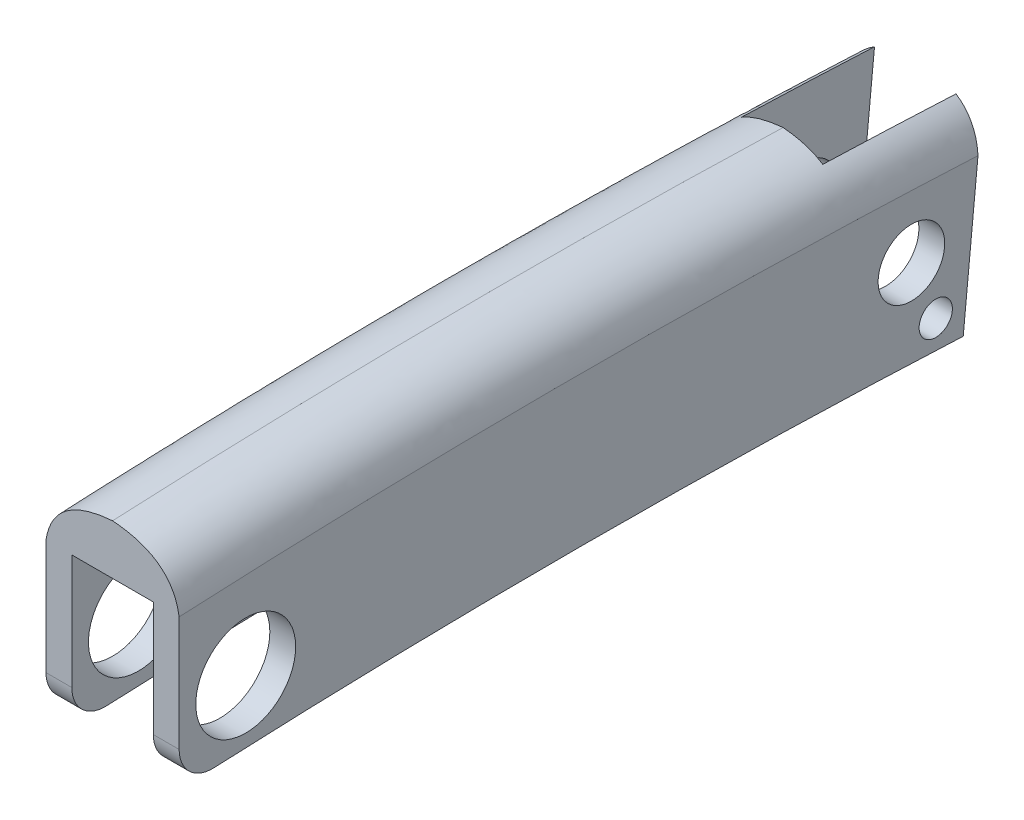
ISO-10303-21;
HEADER;
FILE_DESCRIPTION(('STEP AP214'),'2;1');
FILE_NAME('part.step','',(''),(''),'','','');
FILE_SCHEMA(('AUTOMOTIVE_DESIGN { 1 0 10303 214 1 1 1 1 }'));
ENDSEC;
DATA;
#1=APPLICATION_CONTEXT('core data for automotive mechanical design processes');
#2=APPLICATION_PROTOCOL_DEFINITION('international standard','automotive_design',2000,#1);
#3=PRODUCT_CONTEXT('',#1,'mechanical');
#4=PRODUCT('Part','Part','',(#3));
#5=PRODUCT_RELATED_PRODUCT_CATEGORY('part','',(#4));
#6=PRODUCT_DEFINITION_FORMATION('','',#4);
#7=PRODUCT_DEFINITION_CONTEXT('part definition',#1,'design');
#8=PRODUCT_DEFINITION('design','',#6,#7);
#9=PRODUCT_DEFINITION_SHAPE('','',#8);
#10=(LENGTH_UNIT() NAMED_UNIT(*) SI_UNIT(.MILLI.,.METRE.));
#11=(NAMED_UNIT(*) PLANE_ANGLE_UNIT() SI_UNIT($,.RADIAN.));
#12=(NAMED_UNIT(*) SI_UNIT($,.STERADIAN.) SOLID_ANGLE_UNIT());
#13=UNCERTAINTY_MEASURE_WITH_UNIT(LENGTH_MEASURE(1.E-05),#10,'distance_accuracy_value','');
#14=(GEOMETRIC_REPRESENTATION_CONTEXT(3) GLOBAL_UNCERTAINTY_ASSIGNED_CONTEXT((#13)) GLOBAL_UNIT_ASSIGNED_CONTEXT((#10,
#11,#12)) REPRESENTATION_CONTEXT('',''));
#15=CARTESIAN_POINT('',(0.,0.,0.));
#16=DIRECTION('',(0.,0.,1.));
#17=DIRECTION('',(1.,0.,0.));
#18=AXIS2_PLACEMENT_3D('',#15,#16,#17);
#19=CARTESIAN_POINT('',(1.39461895931958,1.05148344148261,-24.104203652002));
#20=DIRECTION('',(0.,-0.0986184738101588,-0.99512531704472));
#21=DIRECTION('',(-1.,0.,0.));
#22=AXIS2_PLACEMENT_3D('',#19,#20,#21);
#23=PLANE('',#22);
#24=DIRECTION('',(0.,-0.99512531704472,0.0986184738101588));
#25=VECTOR('',#24,1.);
#26=CARTESIAN_POINT('',(1.22480620155039,0.,-24.));
#27=LINE('',#26,#25);
#28=CARTESIAN_POINT('',(1.22480620155039,1.16292013894074,-24.1152472028408));
#29=VERTEX_POINT('',#28);
#30=CARTESIAN_POINT('',(1.22480620155039,-4.47806392670124,-23.5562168678543));
#31=VERTEX_POINT('',#30);
#32=EDGE_CURVE('E136',#29,#31,#27,.T.);
#33=ORIENTED_EDGE('',*,*,#32,.F.);
#34=CARTESIAN_POINT('',(2.,0.,-24.));
#35=CARTESIAN_POINT('',(1.78923791863915,1.35662289518167,-24.1344434486463));
#36=CARTESIAN_POINT('',(0.,1.49268797556708,-24.1479277107152));
#37=B_SPLINE_CURVE_WITH_KNOTS('',2,(#34,#35,#36),.UNSPECIFIED.,.F.,.F.,(3,3),(0.,1.),.UNSPECIFIED.);
#38=CARTESIAN_POINT('',(2.,0.,-24.));
#39=VERTEX_POINT('',#38);
#40=EDGE_CURVE('E140',#39,#29,#37,.T.);
#41=ORIENTED_EDGE('',*,*,#40,.F.);
#42=DIRECTION('',(0.,0.99512531704472,-0.0986184738101588));
#43=VECTOR('',#42,1.);
#44=CARTESIAN_POINT('',(2.,-4.47806392670124,-23.5562168678543));
#45=LINE('',#44,#43);
#46=CARTESIAN_POINT('',(2.,-4.47806392670124,-23.5562168678543));
#47=VERTEX_POINT('',#46);
#48=EDGE_CURVE('E165',#47,#39,#45,.T.);
#49=ORIENTED_EDGE('',*,*,#48,.F.);
#50=DIRECTION('',(1.,0.,0.));
#51=VECTOR('',#50,1.);
#52=CARTESIAN_POINT('',(1.22480620155039,-4.47806392670124,-23.5562168678543));
#53=LINE('',#52,#51);
#54=EDGE_CURVE('E143',#31,#47,#53,.T.);
#55=ORIENTED_EDGE('',*,*,#54,.F.);
#56=EDGE_LOOP('',(#33,#41,#49,#55));
#57=FACE_BOUND('',#56,.T.);
#58=ADVANCED_FACE('F39',(#57),#23,.T.);
#59=CARTESIAN_POINT('',(1.39461895931958,1.05663419819853,0.));
#60=DIRECTION('',(0.,0.,-1.));
#61=DIRECTION('',(-1.,0.,0.));
#62=AXIS2_PLACEMENT_3D('',#59,#60,#61);
#63=PLANE('',#62);
#64=DIRECTION('',(0.,-1.,0.));
#65=VECTOR('',#64,1.);
#66=CARTESIAN_POINT('',(-2.,-4.5,0.));
#67=LINE('',#66,#65);
#68=CARTESIAN_POINT('',(-2.,0.,0.));
#69=VERTEX_POINT('',#68);
#70=CARTESIAN_POINT('',(-2.,-3.45068630741187,0.));
#71=VERTEX_POINT('',#70);
#72=EDGE_CURVE('E198',#69,#71,#67,.T.);
#73=ORIENTED_EDGE('',*,*,#72,.T.);
#74=DIRECTION('',(1.,0.,0.));
#75=VECTOR('',#74,1.);
#76=CARTESIAN_POINT('',(1.39461895931958,-3.45068630741186,0.));
#77=LINE('',#76,#75);
#78=CARTESIAN_POINT('',(-1.22480620155039,-3.45068630741187,0.));
#79=VERTEX_POINT('',#78);
#80=EDGE_CURVE('E277',#71,#79,#77,.T.);
#81=ORIENTED_EDGE('',*,*,#80,.T.);
#82=DIRECTION('',(0.,1.,0.));
#83=VECTOR('',#82,1.);
#84=CARTESIAN_POINT('',(-1.22480620155039,0.,0.));
#85=LINE('',#84,#83);
#86=CARTESIAN_POINT('',(-1.22480620155039,0.,0.));
#87=VERTEX_POINT('',#86);
#88=EDGE_CURVE('E220',#79,#87,#85,.T.);
#89=ORIENTED_EDGE('',*,*,#88,.T.);
#90=DIRECTION('',(1.,0.,0.));
#91=VECTOR('',#90,1.);
#92=CARTESIAN_POINT('',(-1.22480620155039,0.,0.));
#93=LINE('',#92,#91);
#94=CARTESIAN_POINT('',(1.22480620155039,0.,0.));
#95=VERTEX_POINT('',#94);
#96=EDGE_CURVE('E246',#87,#95,#93,.T.);
#97=ORIENTED_EDGE('',*,*,#96,.T.);
#98=DIRECTION('',(0.,-1.,0.));
#99=VECTOR('',#98,1.);
#100=CARTESIAN_POINT('',(1.22480620155039,0.,0.));
#101=LINE('',#100,#99);
#102=CARTESIAN_POINT('',(1.22480620155039,-3.45068630741208,0.));
#103=VERTEX_POINT('',#102);
#104=EDGE_CURVE('E347',#95,#103,#101,.T.);
#105=ORIENTED_EDGE('',*,*,#104,.T.);
#106=DIRECTION('',(1.,0.,0.));
#107=VECTOR('',#106,1.);
#108=CARTESIAN_POINT('',(1.39461895931958,-3.45068630741208,0.));
#109=LINE('',#108,#107);
#110=CARTESIAN_POINT('',(2.,-3.45068630741208,0.));
#111=VERTEX_POINT('',#110);
#112=EDGE_CURVE('E249',#103,#111,#109,.T.);
#113=ORIENTED_EDGE('',*,*,#112,.T.);
#114=DIRECTION('',(0.,1.,0.));
#115=VECTOR('',#114,1.);
#116=CARTESIAN_POINT('',(2.,-4.5,0.));
#117=LINE('',#116,#115);
#118=CARTESIAN_POINT('',(2.,0.,0.));
#119=VERTEX_POINT('',#118);
#120=EDGE_CURVE('E350',#111,#119,#117,.T.);
#121=ORIENTED_EDGE('',*,*,#120,.T.);
#122=CARTESIAN_POINT('',(2.,0.,0.));
#123=CARTESIAN_POINT('',(1.78923791863915,1.36326839639706,0.));
#124=CARTESIAN_POINT('',(0.,1.5,0.));
#125=B_SPLINE_CURVE_WITH_KNOTS('',2,(#122,#123,#124),.UNSPECIFIED.,.F.,.F.,(3,3),(0.,1.),.UNSPECIFIED.);
#126=CARTESIAN_POINT('',(0.,1.5,0.));
#127=VERTEX_POINT('',#126);
#128=EDGE_CURVE('E176',#119,#127,#125,.T.);
#129=ORIENTED_EDGE('',*,*,#128,.T.);
#130=CARTESIAN_POINT('',(0.,1.5,0.));
#131=CARTESIAN_POINT('',(-1.78923791863915,1.36326839639706,0.));
#132=CARTESIAN_POINT('',(-2.,0.,0.));
#133=B_SPLINE_CURVE_WITH_KNOTS('',2,(#130,#131,#132),.UNSPECIFIED.,.F.,.F.,(3,3),(0.,1.),.UNSPECIFIED.);
#134=EDGE_CURVE('E190',#127,#69,#133,.T.);
#135=ORIENTED_EDGE('',*,*,#134,.T.);
#136=EDGE_LOOP('',(#73,#81,#89,#97,#105,#113,#121,#129,#135));
#137=FACE_BOUND('',#136,.T.);
#138=ADVANCED_FACE('F388',(#137),#63,.F.);
#139=CARTESIAN_POINT('',(0.,1.49268797556708,-24.1479277107152));
#140=CARTESIAN_POINT('',(-1.78923791863915,1.35662289518167,-24.1344434486463));
#141=CARTESIAN_POINT('',(-2.,0.,-24.));
#142=B_SPLINE_CURVE_WITH_KNOTS('',2,(#139,#140,#141),.UNSPECIFIED.,.F.,.F.,(3,3),(0.,1.),.UNSPECIFIED.);
#143=CARTESIAN_POINT('',(-1.22480620155039,1.16292013894073,-24.1152472028408));
#144=VERTEX_POINT('',#143);
#145=CARTESIAN_POINT('',(-2.,0.,-24.));
#146=VERTEX_POINT('',#145);
#147=EDGE_CURVE('E164',#144,#146,#142,.T.);
#148=ORIENTED_EDGE('',*,*,#147,.F.);
#149=DIRECTION('',(0.,0.99512531704472,-0.0986184738101588));
#150=VECTOR('',#149,1.);
#151=CARTESIAN_POINT('',(-1.22480620155039,0.,-24.));
#152=LINE('',#151,#150);
#153=CARTESIAN_POINT('',(-1.22480620155039,-4.47806392670124,-23.5562168678543));
#154=VERTEX_POINT('',#153);
#155=EDGE_CURVE('E236',#154,#144,#152,.T.);
#156=ORIENTED_EDGE('',*,*,#155,.F.);
#157=DIRECTION('',(1.,0.,0.));
#158=VECTOR('',#157,1.);
#159=CARTESIAN_POINT('',(-1.22480620155039,-4.47806392670124,-23.5562168678543));
#160=LINE('',#159,#158);
#161=CARTESIAN_POINT('',(-2.,-4.47806392670124,-23.5562168678543));
#162=VERTEX_POINT('',#161);
#163=EDGE_CURVE('E224',#162,#154,#160,.T.);
#164=ORIENTED_EDGE('',*,*,#163,.F.);
#165=DIRECTION('',(0.,-0.99512531704472,0.0986184738101588));
#166=VECTOR('',#165,1.);
#167=CARTESIAN_POINT('',(-2.,-4.47806392670124,-23.5562168678543));
#168=LINE('',#167,#166);
#169=EDGE_CURVE('E169',#146,#162,#168,.T.);
#170=ORIENTED_EDGE('',*,*,#169,.F.);
#171=EDGE_LOOP('',(#148,#156,#164,#170));
#172=FACE_BOUND('',#171,.T.);
#173=ADVANCED_FACE('F415',(#172),#23,.T.);
#174=CARTESIAN_POINT('',(1.22480620155039,0.,0.));
#175=DIRECTION('',(1.,0.,0.));
#176=DIRECTION('',(0.,0.,-1.));
#177=AXIS2_PLACEMENT_3D('',#174,#175,#176);
#178=PLANE('',#177);
#179=CARTESIAN_POINT('',(1.22480620155039,-1.78431168689243,-22.));
#180=DIRECTION('',(1.,0.,0.));
#181=DIRECTION('',(0.,0.,-1.));
#182=AXIS2_PLACEMENT_3D('',#179,#180,#181);
#183=CIRCLE('',#182,1.);
#184=CARTESIAN_POINT('',(1.22480620155039,-1.78431168689243,-23.));
#185=VERTEX_POINT('',#184);
#186=EDGE_CURVE('E273',#185,#185,#183,.T.);
#187=ORIENTED_EDGE('',*,*,#186,.T.);
#188=EDGE_LOOP('',(#187));
#189=FACE_BOUND('',#188,.T.);
#190=ORIENTED_EDGE('',*,*,#32,.T.);
#191=CARTESIAN_POINT('',(1.22480620155039,-4.5,0.));
#192=CARTESIAN_POINT('',(1.22480620155039,-4.10456249901639,-7.85373944947862));
#193=CARTESIAN_POINT('',(1.22480620155039,-4.09722065027209,-15.7050973369004));
#194=CARTESIAN_POINT('',(1.22480620155039,-4.47806392670124,-23.5562168678543));
#195=B_SPLINE_CURVE_WITH_KNOTS('',3,(#191,#192,#193,#194),.UNSPECIFIED.,.F.,.F.,(4,4),(0.,1.),.UNSPECIFIED.);
#196=CARTESIAN_POINT('',(1.22480620155039,-4.44963162844105,-1.04591563561927));
#197=VERTEX_POINT('',#196);
#198=EDGE_CURVE('E352',#197,#31,#195,.T.);
#199=ORIENTED_EDGE('',*,*,#198,.F.);
#200=CARTESIAN_POINT('',(1.22480620155039,-3.45068630741208,-1.));
#201=DIRECTION('',(1.,0.,0.));
#202=DIRECTION('',(0.,0.,-1.));
#203=AXIS2_PLACEMENT_3D('',#200,#201,#202);
#204=CIRCLE('',#203,1.);
#205=EDGE_CURVE('E48',#197,#103,#204,.F.);
#206=ORIENTED_EDGE('',*,*,#205,.T.);
#207=ORIENTED_EDGE('',*,*,#104,.F.);
#208=CARTESIAN_POINT('',(1.22480620155039,0.,0.));
#209=CARTESIAN_POINT('',(1.22480620155039,0.395437695969476,-8.00161159030092));
#210=CARTESIAN_POINT('',(1.22480620155039,0.395437695969232,-16.0016115903009));
#211=CARTESIAN_POINT('',(1.22480620155039,0.,-24.));
#212=B_SPLINE_CURVE_WITH_KNOTS('',3,(#208,#209,#210,#211),.UNSPECIFIED.,.F.,.F.,(4,4),(0.,1.),.UNSPECIFIED.);
#213=CARTESIAN_POINT('',(1.22480620155039,0.164895013272261,-19.9967471058993));
#214=VERTEX_POINT('',#213);
#215=EDGE_CURVE('E261',#95,#214,#212,.T.);
#216=ORIENTED_EDGE('',*,*,#215,.T.);
#217=DIRECTION('',(0.,-0.99512531704472,0.098618473810159));
#218=VECTOR('',#217,1.);
#219=CARTESIAN_POINT('',(1.22480620155039,-1.27601024544671,-19.8539511433346));
#220=LINE('',#219,#218);
#221=CARTESIAN_POINT('',(1.22480620155039,1.32891434228703,-20.1121032401939));
#222=VERTEX_POINT('',#221);
#223=EDGE_CURVE('E55',#222,#214,#220,.T.);
#224=ORIENTED_EDGE('',*,*,#223,.F.);
#225=CARTESIAN_POINT('',(1.22480620175738,1.16292013870207,-24.1152472028171));
#226=CARTESIAN_POINT('',(1.22480620164028,1.21241449281841,-23.1189778390496));
#227=CARTESIAN_POINT('',(1.22480620157128,1.25580710936408,-22.1224696113066));
#228=CARTESIAN_POINT('',(1.22480620154132,1.30929175315763,-20.6928797325446));
#229=CARTESIAN_POINT('',(1.22480620154132,1.32433486612536,-20.2599919010734));
#230=CARTESIAN_POINT('',(1.22480620155039,1.33822732724227,-19.8270590251749));
#231=B_SPLINE_CURVE_WITH_KNOTS('',3,(#225,#226,#227,#228,#229,#230),.UNSPECIFIED.,.F.,.F.,(4,2,
4),(0.,2.99235761635715,4.29180501004106),.UNSPECIFIED.);
#232=EDGE_CURVE('E149',#29,#222,#231,.T.);
#233=ORIENTED_EDGE('',*,*,#232,.F.);
#234=EDGE_LOOP('',(#190,#199,#206,#207,#216,#224,#233));
#235=FACE_BOUND('',#234,.T.);
#236=CARTESIAN_POINT('',(1.22480620155039,-3.59724309092662,-22.7307477302088));
#237=DIRECTION('',(1.,0.,0.));
#238=DIRECTION('',(0.,0.,-1.));
#239=AXIS2_PLACEMENT_3D('',#236,#237,#238);
#240=CIRCLE('',#239,0.499999999999999);
#241=CARTESIAN_POINT('',(1.22480620155039,-3.59724309092662,-23.2307477302088));
#242=VERTEX_POINT('',#241);
#243=EDGE_CURVE('E306',#242,#242,#240,.T.);
#244=ORIENTED_EDGE('',*,*,#243,.T.);
#245=EDGE_LOOP('',(#244));
#246=FACE_BOUND('',#245,.T.);
#247=CARTESIAN_POINT('',(1.22480620155039,-2.52419496384863,-2.));
#248=DIRECTION('',(1.,0.,0.));
#249=DIRECTION('',(0.,0.,-1.));
#250=AXIS2_PLACEMENT_3D('',#247,#248,#249);
#251=CIRCLE('',#250,1.5);
#252=CARTESIAN_POINT('',(1.22480620155039,-2.52419496384863,-3.5));
#253=VERTEX_POINT('',#252);
#254=EDGE_CURVE('E343',#253,#253,#251,.T.);
#255=ORIENTED_EDGE('',*,*,#254,.T.);
#256=EDGE_LOOP('',(#255));
#257=FACE_BOUND('',#256,.T.);
#258=ADVANCED_FACE('F150',(#189,#235,#246,#257),#178,.F.);
#259=CARTESIAN_POINT('',(1.22480620155039,-4.5,0.));
#260=CARTESIAN_POINT('',(1.22480620155039,-4.10456249901639,-7.85373944947862));
#261=CARTESIAN_POINT('',(1.22480620155039,-4.09722065027209,-15.7050973369004));
#262=CARTESIAN_POINT('',(1.22480620155039,-4.47806392670124,-23.5562168678543));
#263=CARTESIAN_POINT('',(2.,-4.5,0.));
#264=CARTESIAN_POINT('',(2.,-4.10456249901639,-7.85373944947862));
#265=CARTESIAN_POINT('',(2.,-4.09722065027209,-15.7050973369004));
#266=CARTESIAN_POINT('',(2.,-4.47806392670124,-23.5562168678543));
#267=B_SPLINE_SURFACE_WITH_KNOTS('',1,3,((#259,#260,#261,#262),(#263,#264,#265,#266)),
.UNSPECIFIED.,.F.,.F.,.F.,(2,2),(4,4),(0.,1.),(0.,1.),.UNSPECIFIED.);
#268=CARTESIAN_POINT('',(2.,-4.5,0.));
#269=CARTESIAN_POINT('',(2.,-4.10456249901639,-7.85373944947862));
#270=CARTESIAN_POINT('',(2.,-4.09722065027209,-15.7050973369004));
#271=CARTESIAN_POINT('',(2.,-4.47806392670124,-23.5562168678543));
#272=B_SPLINE_CURVE_WITH_KNOTS('',3,(#268,#269,#270,#271),.UNSPECIFIED.,.F.,.F.,(4,4),(0.,1.),.UNSPECIFIED.);
#273=CARTESIAN_POINT('',(2.,-4.44963162844105,-1.04591563561927));
#274=VERTEX_POINT('',#273);
#275=EDGE_CURVE('E357',#274,#47,#272,.T.);
#276=DIRECTION('',(1.,0.,0.));
#277=VECTOR('',#276,1.);
#278=CARTESIAN_POINT('',(2.,-4.44963162844105,-1.04591563561927));
#279=LINE('',#278,#277);
#280=EDGE_CURVE('E62',#274,#197,#279,.F.);
#281=ORIENTED_EDGE('',*,*,#275,.F.);
#282=ORIENTED_EDGE('',*,*,#280,.T.);
#283=ORIENTED_EDGE('',*,*,#198,.T.);
#284=ORIENTED_EDGE('',*,*,#54,.T.);
#285=EDGE_LOOP('',(#281,#282,#283,#284));
#286=FACE_BOUND('',#285,.T.);
#287=ADVANCED_FACE('F462',(#286),#267,.F.);
#288=CARTESIAN_POINT('',(2.,-4.5,0.));
#289=DIRECTION('',(1.,0.,0.));
#290=DIRECTION('',(0.,0.,-1.));
#291=AXIS2_PLACEMENT_3D('',#288,#289,#290);
#292=PLANE('',#291);
#293=CARTESIAN_POINT('',(2.,-3.59724309092662,-22.7307477302088));
#294=DIRECTION('',(1.,0.,0.));
#295=DIRECTION('',(0.,0.,-1.));
#296=AXIS2_PLACEMENT_3D('',#293,#294,#295);
#297=CIRCLE('',#296,0.499999999999999);
#298=CARTESIAN_POINT('',(2.,-3.59724309092662,-23.2307477302088));
#299=VERTEX_POINT('',#298);
#300=EDGE_CURVE('E300',#299,#299,#297,.T.);
#301=ORIENTED_EDGE('',*,*,#300,.F.);
#302=EDGE_LOOP('',(#301));
#303=FACE_BOUND('',#302,.T.);
#304=CARTESIAN_POINT('',(2.,-2.52419496384863,-2.));
#305=DIRECTION('',(1.,0.,0.));
#306=DIRECTION('',(0.,0.,-1.));
#307=AXIS2_PLACEMENT_3D('',#304,#305,#306);
#308=CIRCLE('',#307,1.5);
#309=CARTESIAN_POINT('',(2.,-2.52419496384863,-3.5));
#310=VERTEX_POINT('',#309);
#311=EDGE_CURVE('E267',#310,#310,#308,.T.);
#312=ORIENTED_EDGE('',*,*,#311,.F.);
#313=EDGE_LOOP('',(#312));
#314=FACE_BOUND('',#313,.T.);
#315=CARTESIAN_POINT('',(2.,-1.78431168689243,-22.));
#316=DIRECTION('',(1.,0.,0.));
#317=DIRECTION('',(0.,0.,-1.));
#318=AXIS2_PLACEMENT_3D('',#315,#316,#317);
#319=CIRCLE('',#318,1.);
#320=CARTESIAN_POINT('',(2.,-1.78431168689243,-23.));
#321=VERTEX_POINT('',#320);
#322=EDGE_CURVE('E327',#321,#321,#319,.T.);
#323=ORIENTED_EDGE('',*,*,#322,.F.);
#324=EDGE_LOOP('',(#323));
#325=FACE_BOUND('',#324,.T.);
#326=ORIENTED_EDGE('',*,*,#120,.F.);
#327=CARTESIAN_POINT('',(2.,-3.45068630741208,-1.));
#328=DIRECTION('',(1.,0.,0.));
#329=DIRECTION('',(0.,0.,-1.));
#330=AXIS2_PLACEMENT_3D('',#327,#328,#329);
#331=CIRCLE('',#330,1.);
#332=EDGE_CURVE('E290',#111,#274,#331,.T.);
#333=ORIENTED_EDGE('',*,*,#332,.T.);
#334=ORIENTED_EDGE('',*,*,#275,.T.);
#335=ORIENTED_EDGE('',*,*,#48,.T.);
#336=CARTESIAN_POINT('',(2.,0.,0.));
#337=CARTESIAN_POINT('',(2.,0.395437695969476,-8.00161159030092));
#338=CARTESIAN_POINT('',(2.,0.395437695969233,-16.0016115903009));
#339=CARTESIAN_POINT('',(2.,0.,-24.));
#340=B_SPLINE_CURVE_WITH_KNOTS('',3,(#336,#337,#338,#339),.UNSPECIFIED.,.F.,.F.,(4,4),(0.,1.),.UNSPECIFIED.);
#341=EDGE_CURVE('E162',#119,#39,#340,.T.);
#342=ORIENTED_EDGE('',*,*,#341,.F.);
#343=EDGE_LOOP('',(#326,#333,#334,#335,#342));
#344=FACE_BOUND('',#343,.T.);
#345=ADVANCED_FACE('F468',(#303,#314,#325,#344),#292,.T.);
#346=CARTESIAN_POINT('',(2.,0.,0.));
#347=CARTESIAN_POINT('',(2.,0.395437695969476,-8.00161159030092));
#348=CARTESIAN_POINT('',(2.,0.395437695969233,-16.0016115903009));
#349=CARTESIAN_POINT('',(2.,0.,-24.));
#350=CARTESIAN_POINT('',(1.78923791863915,1.36326839639706,0.));
#351=CARTESIAN_POINT('',(1.78923791863915,1.7587061498258,-8.04640923431469));
#352=CARTESIAN_POINT('',(1.78923791863915,1.75648195047334,-16.0914401440597));
#353=CARTESIAN_POINT('',(1.78923791863915,1.35662289518167,-24.1344434486463));
#354=CARTESIAN_POINT('',(0.,1.5,0.));
#355=CARTESIAN_POINT('',(0.,1.89543775914785,-8.0509022993508));
#356=CARTESIAN_POINT('',(0.,1.89299047955518,-16.1004496700586));
#357=CARTESIAN_POINT('',(0.,1.49268797556708,-24.1479277107152));
#358=B_SPLINE_SURFACE_WITH_KNOTS('',2,3,((#346,#347,#348,#349),(#350,#351,#352,#353),(#354,#355,
#356,#357)),.UNSPECIFIED.,.F.,.F.,.F.,(3,3),(4,4),(0.,1.),(0.,1.),.UNSPECIFIED.);
#359=CARTESIAN_POINT('',(1.22480620155039,1.32891434228703,-20.1121032401939));
#360=CARTESIAN_POINT('',(1.18780166239054,1.35025735432368,-20.1142183660353));
#361=CARTESIAN_POINT('',(1.15005981903821,1.37029773015011,-20.116204398593));
#362=CARTESIAN_POINT('',(1.07345952001883,1.40788226824846,-20.1199290850446));
#363=CARTESIAN_POINT('',(1.03460420283003,1.42543274901886,-20.1216683651118));
#364=CARTESIAN_POINT('',(0.955965582235968,1.45824498003402,-20.1249201084747));
#365=CARTESIAN_POINT('',(0.916182874781345,1.47350815569342,-20.1264327130314));
#366=CARTESIAN_POINT('',(0.83639159962772,1.5017476314247,-20.1292312892008));
#367=CARTESIAN_POINT('',(0.796392679260094,1.51475106320426,-20.1305199496081));
#368=CARTESIAN_POINT('',(0.715805956775999,1.53888211331115,-20.1329113743786));
#369=CARTESIAN_POINT('',(0.675217834790388,1.55000866793238,-20.1340140333269));
#370=CARTESIAN_POINT('',(0.593602559785206,1.57053418621414,-20.1360481442599));
#371=CARTESIAN_POINT('',(0.552575372609822,1.57993301442207,-20.1369795828211));
#372=CARTESIAN_POINT('',(0.427511682825066,1.60608103751413,-20.139570892766));
#373=CARTESIAN_POINT('',(0.342953591898461,1.62035698336562,-20.1409856613062));
#374=CARTESIAN_POINT('',(0.172293482260946,1.64353752919616,-20.1432828896177));
#375=CARTESIAN_POINT('',(0.0861844162040282,1.65239161861038,-20.1441603437133));
#376=CARTESIAN_POINT('',(5.04763850139193E-11,1.65899195896781,-20.1448144477558));
#377=B_SPLINE_CURVE_WITH_KNOTS('',3,(#359,#360,#361,#362,#363,#364,#365,#366,#367,#368,#369,
#370,#371,#372,#373,#374,#375,#376),.UNSPECIFIED.,.F.,.F.,(4,2,2,2,2,2,2,2,4),(0.,
0.128258942404553,0.256186351485311,0.384033703577251,0.51022027097993,0.636478115134938,
0.762745853602809,1.01983221992444,1.27927857252972),.UNSPECIFIED.);
#378=CARTESIAN_POINT('',(0.,1.65899195891238,-20.1448144458785));
#379=VERTEX_POINT('',#378);
#380=EDGE_CURVE('E309',#222,#379,#377,.T.);
#381=CARTESIAN_POINT('',(0.,1.5,0.));
#382=CARTESIAN_POINT('',(0.,1.89543775914785,-8.0509022993508));
#383=CARTESIAN_POINT('',(0.,1.89299047955518,-16.1004496700586));
#384=CARTESIAN_POINT('',(0.,1.49268797556708,-24.1479277107152));
#385=B_SPLINE_CURVE_WITH_KNOTS('',3,(#381,#382,#383,#384),.UNSPECIFIED.,.F.,.F.,(4,4),(0.,1.),.UNSPECIFIED.);
#386=EDGE_CURVE('E180',#127,#379,#385,.T.);
#387=ORIENTED_EDGE('',*,*,#40,.T.);
#388=ORIENTED_EDGE('',*,*,#232,.T.);
#389=ORIENTED_EDGE('',*,*,#380,.T.);
#390=ORIENTED_EDGE('',*,*,#386,.F.);
#391=ORIENTED_EDGE('',*,*,#128,.F.);
#392=ORIENTED_EDGE('',*,*,#341,.T.);
#393=EDGE_LOOP('',(#387,#388,#389,#390,#391,#392));
#394=FACE_BOUND('',#393,.T.);
#395=ADVANCED_FACE('F159',(#394),#358,.F.);
#396=CARTESIAN_POINT('',(0.,1.5,0.));
#397=CARTESIAN_POINT('',(0.,1.89543775914785,-8.0509022993508));
#398=CARTESIAN_POINT('',(0.,1.89299047955518,-16.1004496700586));
#399=CARTESIAN_POINT('',(0.,1.49268797556708,-24.1479277107152));
#400=CARTESIAN_POINT('',(-1.78923791863915,1.36326839639706,0.));
#401=CARTESIAN_POINT('',(-1.78923791863915,1.7587061498258,-8.04640923431469));
#402=CARTESIAN_POINT('',(-1.78923791863915,1.75648195047334,-16.0914401440597));
#403=CARTESIAN_POINT('',(-1.78923791863915,1.35662289518167,-24.1344434486463));
#404=CARTESIAN_POINT('',(-2.,0.,0.));
#405=CARTESIAN_POINT('',(-2.,0.395437695969476,-8.00161159030092));
#406=CARTESIAN_POINT('',(-2.,0.395437695969232,-16.0016115903009));
#407=CARTESIAN_POINT('',(-2.,0.,-24.));
#408=B_SPLINE_SURFACE_WITH_KNOTS('',2,3,((#396,#397,#398,#399),(#400,#401,#402,#403),(#404,#405,
#406,#407)),.UNSPECIFIED.,.F.,.F.,.F.,(3,3),(4,4),(0.,1.),(0.,1.),.UNSPECIFIED.);
#409=CARTESIAN_POINT('',(0.,1.65899195891238,-20.1448144458785));
#410=CARTESIAN_POINT('',(-0.0536741833299928,1.65490044751213,-20.1444089719041));
#411=CARTESIAN_POINT('',(-0.107289790702874,1.6499191267307,-20.143915315724));
#412=CARTESIAN_POINT('',(-0.214499805071598,1.63791912169199,-20.1427260968367));
#413=CARTESIAN_POINT('',(-0.268093319367912,1.63089259242495,-20.1420297566745));
#414=CARTESIAN_POINT('',(-0.375008818337136,1.61456143196465,-20.140411313058));
#415=CARTESIAN_POINT('',(-0.42833033354197,1.60525370980623,-20.1394889032845));
#416=CARTESIAN_POINT('',(-0.533317876243407,1.58431330253499,-20.1374136762299));
#417=CARTESIAN_POINT('',(-0.584994791838744,1.57273514869334,-20.136266263084));
#418=CARTESIAN_POINT('',(-0.687596472965073,1.54685801435364,-20.133701798631));
#419=CARTESIAN_POINT('',(-0.738522074102235,1.53256234811397,-20.132285075772));
#420=CARTESIAN_POINT('',(-0.83936601240295,1.50094008768378,-20.1291512603552));
#421=CARTESIAN_POINT('',(-0.889285292778238,1.4836164943992,-20.1274344651918));
#422=CARTESIAN_POINT('',(-0.987700220535246,1.44564439556318,-20.1236713708649));
#423=CARTESIAN_POINT('',(-1.03619917081904,1.42500447312154,-20.121625922301));
#424=CARTESIAN_POINT('',(-1.13178356626084,1.37990299991785,-20.1171562958354));
#425=CARTESIAN_POINT('',(-1.17885653068005,1.3554153560191,-20.114729532063));
#426=CARTESIAN_POINT('',(-1.22480620155039,1.32891434228702,-20.1121032401939));
#427=B_SPLINE_CURVE_WITH_KNOTS('',3,(#409,#410,#411,#412,#413,#414,#415,#416,#417,#418,#419,
#420,#421,#422,#423,#424,#425,#426),.UNSPECIFIED.,.F.,.F.,(4,2,2,2,2,2,2,2,4),(0.,
0.161501548889746,0.323630938302053,0.4859812358526,0.644826585158586,0.803479436506673,
0.961975933273542,1.12006863839364,1.2792838032489),.UNSPECIFIED.);
#428=CARTESIAN_POINT('',(-1.22480620155039,1.32891434228703,-20.1121032401939));
#429=VERTEX_POINT('',#428);
#430=EDGE_CURVE('E314',#379,#429,#427,.T.);
#431=CARTESIAN_POINT('',(-1.22480620155039,1.33822732724226,-19.8270590251749));
#432=CARTESIAN_POINT('',(-1.22480620155047,1.30623244819245,-20.8240438266905));
#433=CARTESIAN_POINT('',(-1.22480620155047,1.26813821802222,-21.8207686997273));
#434=CARTESIAN_POINT('',(-1.22480620155036,1.20475333896742,-23.2499538471762));
#435=CARTESIAN_POINT('',(-1.22480620155031,1.184411839704,-23.682625033357));
#436=CARTESIAN_POINT('',(-1.22480620155024,1.16292013894135,-24.1152472028277));
#437=B_SPLINE_CURVE_WITH_KNOTS('',3,(#431,#432,#433,#434,#435,#436),.UNSPECIFIED.,.F.,.F.,(4,2,
4),(0.,2.99235773030591,4.29180499260283),.UNSPECIFIED.);
#438=EDGE_CURVE('E156',#429,#144,#437,.T.);
#439=CARTESIAN_POINT('',(-2.,0.,0.));
#440=CARTESIAN_POINT('',(-2.,0.395437695969476,-8.00161159030092));
#441=CARTESIAN_POINT('',(-2.,0.395437695969232,-16.0016115903009));
#442=CARTESIAN_POINT('',(-2.,0.,-24.));
#443=B_SPLINE_CURVE_WITH_KNOTS('',3,(#439,#440,#441,#442),.UNSPECIFIED.,.F.,.F.,(4,4),(0.,1.),.UNSPECIFIED.);
#444=EDGE_CURVE('E189',#69,#146,#443,.T.);
#445=ORIENTED_EDGE('',*,*,#430,.T.);
#446=ORIENTED_EDGE('',*,*,#438,.T.);
#447=ORIENTED_EDGE('',*,*,#147,.T.);
#448=ORIENTED_EDGE('',*,*,#444,.F.);
#449=ORIENTED_EDGE('',*,*,#134,.F.);
#450=ORIENTED_EDGE('',*,*,#386,.T.);
#451=EDGE_LOOP('',(#445,#446,#447,#448,#449,#450));
#452=FACE_BOUND('',#451,.T.);
#453=ADVANCED_FACE('F393',(#452),#408,.F.);
#454=CARTESIAN_POINT('',(-2.,-4.5,0.));
#455=DIRECTION('',(1.,0.,0.));
#456=DIRECTION('',(0.,0.,-1.));
#457=AXIS2_PLACEMENT_3D('',#454,#455,#456);
#458=PLANE('',#457);
#459=CARTESIAN_POINT('',(-2.,-3.59724309092662,-22.7307477302088));
#460=DIRECTION('',(1.,0.,0.));
#461=DIRECTION('',(0.,0.,-1.));
#462=AXIS2_PLACEMENT_3D('',#459,#460,#461);
#463=CIRCLE('',#462,0.499999999999999);
#464=CARTESIAN_POINT('',(-2.,-3.59724309092662,-23.2307477302088));
#465=VERTEX_POINT('',#464);
#466=EDGE_CURVE('E299',#465,#465,#463,.T.);
#467=ORIENTED_EDGE('',*,*,#466,.T.);
#468=EDGE_LOOP('',(#467));
#469=FACE_BOUND('',#468,.T.);
#470=CARTESIAN_POINT('',(-2.,-2.52419496384863,-2.));
#471=DIRECTION('',(1.,0.,0.));
#472=DIRECTION('',(0.,0.,-1.));
#473=AXIS2_PLACEMENT_3D('',#470,#471,#472);
#474=CIRCLE('',#473,1.5);
#475=CARTESIAN_POINT('',(-2.,-2.52419496384863,-3.5));
#476=VERTEX_POINT('',#475);
#477=EDGE_CURVE('E272',#476,#476,#474,.T.);
#478=ORIENTED_EDGE('',*,*,#477,.T.);
#479=EDGE_LOOP('',(#478));
#480=FACE_BOUND('',#479,.T.);
#481=CARTESIAN_POINT('',(-2.,-1.78431168689243,-22.));
#482=DIRECTION('',(1.,0.,0.));
#483=DIRECTION('',(0.,0.,-1.));
#484=AXIS2_PLACEMENT_3D('',#481,#482,#483);
#485=CIRCLE('',#484,1.);
#486=CARTESIAN_POINT('',(-2.,-1.78431168689243,-23.));
#487=VERTEX_POINT('',#486);
#488=EDGE_CURVE('E266',#487,#487,#485,.T.);
#489=ORIENTED_EDGE('',*,*,#488,.T.);
#490=EDGE_LOOP('',(#489));
#491=FACE_BOUND('',#490,.T.);
#492=CARTESIAN_POINT('',(-2.,-4.5,0.));
#493=CARTESIAN_POINT('',(-2.,-4.10456249901295,-7.85373944947802));
#494=CARTESIAN_POINT('',(-2.,-4.09722065027212,-15.705097336901));
#495=CARTESIAN_POINT('',(-2.,-4.47806392670124,-23.5562168678543));
#496=B_SPLINE_CURVE_WITH_KNOTS('',3,(#492,#493,#494,#495),.UNSPECIFIED.,.F.,.F.,(4,4),(0.,1.),.UNSPECIFIED.);
#497=CARTESIAN_POINT('',(-2.,-4.44963162844061,-1.04591563561962));
#498=VERTEX_POINT('',#497);
#499=EDGE_CURVE('E213',#498,#162,#496,.T.);
#500=ORIENTED_EDGE('',*,*,#499,.F.);
#501=CARTESIAN_POINT('',(-2.,-3.45068630741187,-1.));
#502=DIRECTION('',(1.,0.,0.));
#503=DIRECTION('',(0.,0.,-1.));
#504=AXIS2_PLACEMENT_3D('',#501,#502,#503);
#505=CIRCLE('',#504,1.);
#506=EDGE_CURVE('E287',#498,#71,#505,.F.);
#507=ORIENTED_EDGE('',*,*,#506,.T.);
#508=ORIENTED_EDGE('',*,*,#72,.F.);
#509=ORIENTED_EDGE('',*,*,#444,.T.);
#510=ORIENTED_EDGE('',*,*,#169,.T.);
#511=EDGE_LOOP('',(#500,#507,#508,#509,#510));
#512=FACE_BOUND('',#511,.T.);
#513=ADVANCED_FACE('F399',(#469,#480,#491,#512),#458,.F.);
#514=CARTESIAN_POINT('',(-2.,-4.5,0.));
#515=CARTESIAN_POINT('',(-2.,-4.10456249901295,-7.85373944947802));
#516=CARTESIAN_POINT('',(-2.,-4.09722065027212,-15.705097336901));
#517=CARTESIAN_POINT('',(-2.,-4.47806392670124,-23.5562168678543));
#518=CARTESIAN_POINT('',(-1.22480620155039,-4.5,0.));
#519=CARTESIAN_POINT('',(-1.22480620155039,-4.10456249901639,-7.85373944947862));
#520=CARTESIAN_POINT('',(-1.22480620155039,-4.09722065027209,-15.7050973369004));
#521=CARTESIAN_POINT('',(-1.22480620155039,-4.47806392670124,-23.5562168678543));
#522=B_SPLINE_SURFACE_WITH_KNOTS('',1,3,((#514,#515,#516,#517),(#518,#519,#520,#521)),
.UNSPECIFIED.,.F.,.F.,.F.,(2,2),(4,4),(0.,1.),(0.,1.),.UNSPECIFIED.);
#523=CARTESIAN_POINT('',(-1.22480620155039,-4.5,0.));
#524=CARTESIAN_POINT('',(-1.22480620155039,-4.10456249901639,-7.85373944947862));
#525=CARTESIAN_POINT('',(-1.22480620155039,-4.09722065027209,-15.7050973369004));
#526=CARTESIAN_POINT('',(-1.22480620155039,-4.47806392670124,-23.5562168678543));
#527=B_SPLINE_CURVE_WITH_KNOTS('',3,(#523,#524,#525,#526),.UNSPECIFIED.,.F.,.F.,(4,4),(0.,1.),.UNSPECIFIED.);
#528=CARTESIAN_POINT('',(-1.22480620155039,-4.44963162844103,-1.04591563561964));
#529=VERTEX_POINT('',#528);
#530=EDGE_CURVE('E229',#529,#154,#527,.T.);
#531=DIRECTION('',(1.,0.,0.));
#532=VECTOR('',#531,1.);
#533=CARTESIAN_POINT('',(-1.22480620155039,-4.44963162844103,-1.04591563561964));
#534=LINE('',#533,#532);
#535=EDGE_CURVE('E284',#529,#498,#534,.F.);
#536=ORIENTED_EDGE('',*,*,#530,.F.);
#537=ORIENTED_EDGE('',*,*,#535,.T.);
#538=ORIENTED_EDGE('',*,*,#499,.T.);
#539=ORIENTED_EDGE('',*,*,#163,.T.);
#540=EDGE_LOOP('',(#536,#537,#538,#539));
#541=FACE_BOUND('',#540,.T.);
#542=ADVANCED_FACE('F412',(#541),#522,.F.);
#543=CARTESIAN_POINT('',(-1.22480620155039,0.,0.));
#544=DIRECTION('',(1.,0.,0.));
#545=DIRECTION('',(0.,0.,-1.));
#546=AXIS2_PLACEMENT_3D('',#543,#544,#545);
#547=PLANE('',#546);
#548=CARTESIAN_POINT('',(-1.22480620155039,-1.78431168689243,-22.));
#549=DIRECTION('',(1.,0.,0.));
#550=DIRECTION('',(0.,0.,-1.));
#551=AXIS2_PLACEMENT_3D('',#548,#549,#550);
#552=CIRCLE('',#551,1.);
#553=CARTESIAN_POINT('',(-1.22480620155039,-1.78431168689243,-23.));
#554=VERTEX_POINT('',#553);
#555=EDGE_CURVE('E262',#554,#554,#552,.F.);
#556=ORIENTED_EDGE('',*,*,#555,.T.);
#557=EDGE_LOOP('',(#556));
#558=FACE_BOUND('',#557,.T.);
#559=CARTESIAN_POINT('',(-1.22480620155039,-3.59724309092662,-22.7307477302088));
#560=DIRECTION('',(1.,0.,0.));
#561=DIRECTION('',(0.,0.,-1.));
#562=AXIS2_PLACEMENT_3D('',#559,#560,#561);
#563=CIRCLE('',#562,0.499999999999999);
#564=CARTESIAN_POINT('',(-1.22480620155039,-3.59724309092662,-23.2307477302088));
#565=VERTEX_POINT('',#564);
#566=EDGE_CURVE('E296',#565,#565,#563,.F.);
#567=ORIENTED_EDGE('',*,*,#566,.T.);
#568=EDGE_LOOP('',(#567));
#569=FACE_BOUND('',#568,.T.);
#570=CARTESIAN_POINT('',(-1.22480620155039,-2.52419496384863,-2.));
#571=DIRECTION('',(1.,0.,0.));
#572=DIRECTION('',(0.,0.,-1.));
#573=AXIS2_PLACEMENT_3D('',#570,#571,#572);
#574=CIRCLE('',#573,1.5);
#575=CARTESIAN_POINT('',(-1.22480620155039,-2.52419496384863,-3.5));
#576=VERTEX_POINT('',#575);
#577=EDGE_CURVE('E268',#576,#576,#574,.F.);
#578=ORIENTED_EDGE('',*,*,#577,.T.);
#579=EDGE_LOOP('',(#578));
#580=FACE_BOUND('',#579,.T.);
#581=ORIENTED_EDGE('',*,*,#155,.T.);
#582=ORIENTED_EDGE('',*,*,#438,.F.);
#583=DIRECTION('',(0.,0.99512531704472,-0.098618473810159));
#584=VECTOR('',#583,1.);
#585=CARTESIAN_POINT('',(-1.22480620155039,-1.27601024544671,-19.8539511433346));
#586=LINE('',#585,#584);
#587=CARTESIAN_POINT('',(-1.22480620155039,0.164895013272262,-19.9967471058993));
#588=VERTEX_POINT('',#587);
#589=EDGE_CURVE('E157',#588,#429,#586,.T.);
#590=ORIENTED_EDGE('',*,*,#589,.F.);
#591=CARTESIAN_POINT('',(-1.22480620155039,0.,0.));
#592=CARTESIAN_POINT('',(-1.22480620155039,0.395437695969476,-8.00161159030092));
#593=CARTESIAN_POINT('',(-1.22480620155039,0.395437695969232,-16.0016115903009));
#594=CARTESIAN_POINT('',(-1.22480620155039,0.,-24.));
#595=B_SPLINE_CURVE_WITH_KNOTS('',3,(#591,#592,#593,#594),.UNSPECIFIED.,.F.,.F.,(4,4),(0.,1.),.UNSPECIFIED.);
#596=EDGE_CURVE('E146',#87,#588,#595,.T.);
#597=ORIENTED_EDGE('',*,*,#596,.F.);
#598=ORIENTED_EDGE('',*,*,#88,.F.);
#599=CARTESIAN_POINT('',(-1.22480620155039,-3.45068630741187,-1.));
#600=DIRECTION('',(1.,0.,0.));
#601=DIRECTION('',(0.,0.,-1.));
#602=AXIS2_PLACEMENT_3D('',#599,#600,#601);
#603=CIRCLE('',#602,1.);
#604=EDGE_CURVE('E281',#79,#529,#603,.T.);
#605=ORIENTED_EDGE('',*,*,#604,.T.);
#606=ORIENTED_EDGE('',*,*,#530,.T.);
#607=EDGE_LOOP('',(#581,#582,#590,#597,#598,#605,#606));
#608=FACE_BOUND('',#607,.T.);
#609=ADVANCED_FACE('F409',(#558,#569,#580,#608),#547,.T.);
#610=CARTESIAN_POINT('',(-1.22480620155039,0.,0.));
#611=CARTESIAN_POINT('',(-1.22480620155039,0.395437695969476,-8.00161159030092));
#612=CARTESIAN_POINT('',(-1.22480620155039,0.395437695969232,-16.0016115903009));
#613=CARTESIAN_POINT('',(-1.22480620155039,0.,-24.));
#614=CARTESIAN_POINT('',(1.22480620155039,0.,0.));
#615=CARTESIAN_POINT('',(1.22480620155039,0.395437695969476,-8.00161159030092));
#616=CARTESIAN_POINT('',(1.22480620155039,0.395437695969232,-16.0016115903009));
#617=CARTESIAN_POINT('',(1.22480620155039,0.,-24.));
#618=B_SPLINE_SURFACE_WITH_KNOTS('',1,3,((#610,#611,#612,#613),(#614,#615,#616,#617)),
.UNSPECIFIED.,.F.,.F.,.F.,(2,2),(4,4),(0.,1.),(0.,1.),.UNSPECIFIED.);
#619=DIRECTION('',(1.,0.,0.));
#620=VECTOR('',#619,1.);
#621=CARTESIAN_POINT('',(0.,0.164895013272261,-19.9967471058993));
#622=LINE('',#621,#620);
#623=EDGE_CURVE('E11',#588,#214,#622,.T.);
#624=ORIENTED_EDGE('',*,*,#596,.T.);
#625=ORIENTED_EDGE('',*,*,#623,.T.);
#626=ORIENTED_EDGE('',*,*,#215,.F.);
#627=ORIENTED_EDGE('',*,*,#96,.F.);
#628=EDGE_LOOP('',(#624,#625,#626,#627));
#629=FACE_BOUND('',#628,.T.);
#630=ADVANCED_FACE('F492',(#629),#618,.F.);
#631=CARTESIAN_POINT('',(-21.,-1.78431168689243,-22.));
#632=DIRECTION('',(1.,0.,0.));
#633=DIRECTION('',(0.,0.,-1.));
#634=AXIS2_PLACEMENT_3D('',#631,#632,#633);
#635=CYLINDRICAL_SURFACE('',#634,1.);
#636=ORIENTED_EDGE('',*,*,#555,.F.);
#637=EDGE_LOOP('',(#636));
#638=FACE_BOUND('',#637,.T.);
#639=ORIENTED_EDGE('',*,*,#488,.F.);
#640=EDGE_LOOP('',(#639));
#641=FACE_BOUND('',#640,.T.);
#642=ADVANCED_FACE('F459',(#638,#641),#635,.F.);
#643=CARTESIAN_POINT('',(-21.,-2.52419496384863,-2.));
#644=DIRECTION('',(1.,0.,0.));
#645=DIRECTION('',(0.,0.,-1.));
#646=AXIS2_PLACEMENT_3D('',#643,#644,#645);
#647=CYLINDRICAL_SURFACE('',#646,1.5);
#648=ORIENTED_EDGE('',*,*,#577,.F.);
#649=EDGE_LOOP('',(#648));
#650=FACE_BOUND('',#649,.T.);
#651=ORIENTED_EDGE('',*,*,#477,.F.);
#652=EDGE_LOOP('',(#651));
#653=FACE_BOUND('',#652,.T.);
#654=ADVANCED_FACE('F455',(#650,#653),#647,.F.);
#655=ORIENTED_EDGE('',*,*,#322,.T.);
#656=EDGE_LOOP('',(#655));
#657=FACE_BOUND('',#656,.T.);
#658=ORIENTED_EDGE('',*,*,#186,.F.);
#659=EDGE_LOOP('',(#658));
#660=FACE_BOUND('',#659,.T.);
#661=ADVANCED_FACE('F453',(#657,#660),#635,.F.);
#662=ORIENTED_EDGE('',*,*,#311,.T.);
#663=EDGE_LOOP('',(#662));
#664=FACE_BOUND('',#663,.T.);
#665=ORIENTED_EDGE('',*,*,#254,.F.);
#666=EDGE_LOOP('',(#665));
#667=FACE_BOUND('',#666,.T.);
#668=ADVANCED_FACE('F450',(#664,#667),#647,.F.);
#669=CARTESIAN_POINT('',(-1.61240310077514,-3.45068630741187,-1.));
#670=DIRECTION('',(1.,0.,0.));
#671=DIRECTION('',(0.,1.,0.));
#672=AXIS2_PLACEMENT_3D('',#669,#670,#671);
#673=CYLINDRICAL_SURFACE('',#672,1.);
#674=ORIENTED_EDGE('',*,*,#506,.F.);
#675=ORIENTED_EDGE('',*,*,#535,.F.);
#676=ORIENTED_EDGE('',*,*,#604,.F.);
#677=ORIENTED_EDGE('',*,*,#80,.F.);
#678=EDGE_LOOP('',(#674,#675,#676,#677));
#679=FACE_BOUND('',#678,.T.);
#680=ADVANCED_FACE('F405',(#679),#673,.T.);
#681=CARTESIAN_POINT('',(1.6124031007752,-3.45068630741208,-1.));
#682=DIRECTION('',(1.,0.,0.));
#683=DIRECTION('',(0.,0.,-1.));
#684=AXIS2_PLACEMENT_3D('',#681,#682,#683);
#685=CYLINDRICAL_SURFACE('',#684,1.);
#686=ORIENTED_EDGE('',*,*,#205,.F.);
#687=ORIENTED_EDGE('',*,*,#280,.F.);
#688=ORIENTED_EDGE('',*,*,#332,.F.);
#689=ORIENTED_EDGE('',*,*,#112,.F.);
#690=EDGE_LOOP('',(#686,#687,#688,#689));
#691=FACE_BOUND('',#690,.T.);
#692=ADVANCED_FACE('F41',(#691),#685,.T.);
#693=CARTESIAN_POINT('',(-21.,-3.59724309092662,-22.7307477302088));
#694=DIRECTION('',(1.,0.,0.));
#695=DIRECTION('',(0.,0.,-1.));
#696=AXIS2_PLACEMENT_3D('',#693,#694,#695);
#697=CYLINDRICAL_SURFACE('',#696,0.499999999999999);
#698=ORIENTED_EDGE('',*,*,#566,.F.);
#699=EDGE_LOOP('',(#698));
#700=FACE_BOUND('',#699,.T.);
#701=ORIENTED_EDGE('',*,*,#466,.F.);
#702=EDGE_LOOP('',(#701));
#703=FACE_BOUND('',#702,.T.);
#704=ADVANCED_FACE('F449',(#700,#703),#697,.F.);
#705=ORIENTED_EDGE('',*,*,#300,.T.);
#706=EDGE_LOOP('',(#705));
#707=FACE_BOUND('',#706,.T.);
#708=ORIENTED_EDGE('',*,*,#243,.F.);
#709=EDGE_LOOP('',(#708));
#710=FACE_BOUND('',#709,.T.);
#711=ADVANCED_FACE('F446',(#707,#710),#697,.F.);
#712=CARTESIAN_POINT('',(0.,-1.96083186516259,-19.7860842507817));
#713=DIRECTION('',(0.,0.0986184738101591,0.99512531704472));
#714=DIRECTION('',(0.,-0.99512531704472,0.0986184738101591));
#715=AXIS2_PLACEMENT_3D('',#712,#713,#714);
#716=PLANE('',#715);
#717=ORIENTED_EDGE('',*,*,#223,.T.);
#718=ORIENTED_EDGE('',*,*,#623,.F.);
#719=ORIENTED_EDGE('',*,*,#589,.T.);
#720=ORIENTED_EDGE('',*,*,#430,.F.);
#721=ORIENTED_EDGE('',*,*,#380,.F.);
#722=EDGE_LOOP('',(#717,#718,#719,#720,#721));
#723=FACE_BOUND('',#722,.T.);
#724=ADVANCED_FACE('F442',(#723),#716,.F.);
#725=CLOSED_SHELL('',(#58,#138,#173,#258,#287,#345,#395,#453,#513,#542,#609,#630,#642,#654,#661,
#668,#680,#692,#704,#711,#724));
#726=MANIFOLD_SOLID_BREP('B2',#725);
#727=ADVANCED_BREP_SHAPE_REPRESENTATION('',(#18,#726),#14);
#728=SHAPE_DEFINITION_REPRESENTATION(#9,#727);
ENDSEC;
END-ISO-10303-21;
